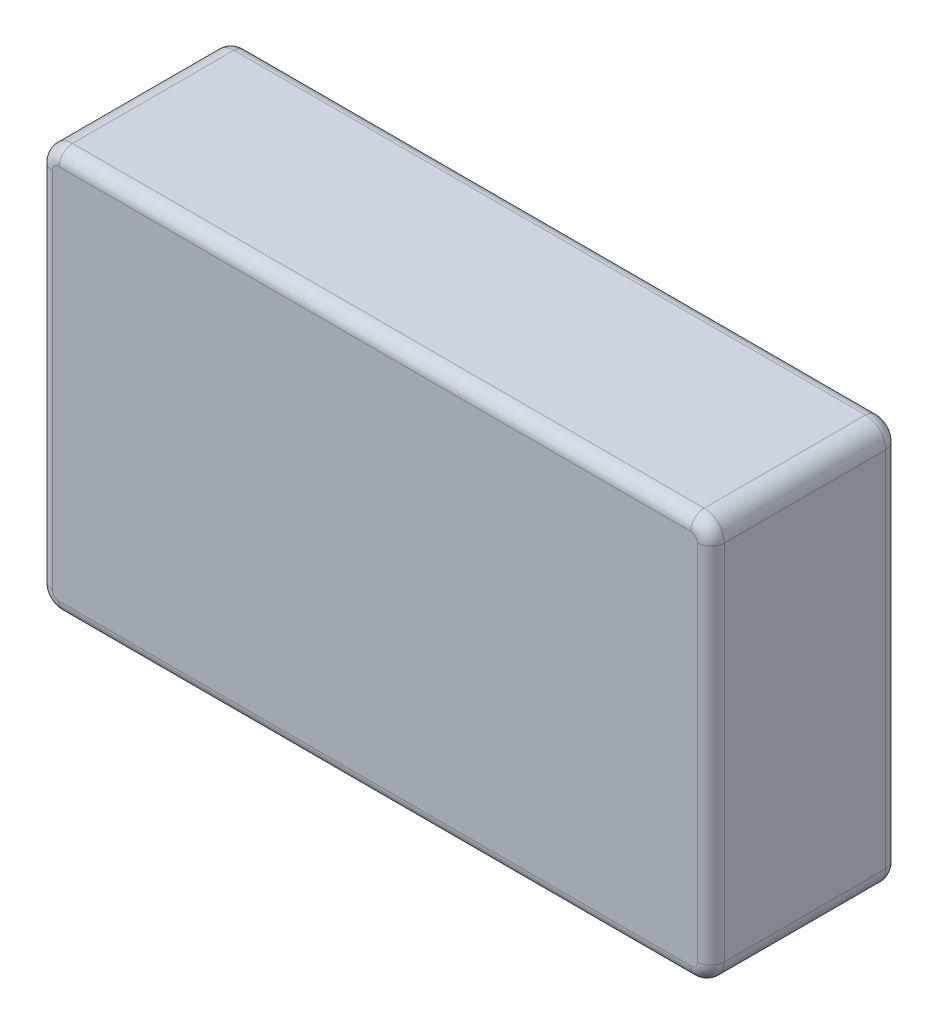
ISO-10303-21;
HEADER;
FILE_DESCRIPTION(('STEP AP214'),'2;1');
FILE_NAME('part.step','',(''),(''),'','','');
FILE_SCHEMA(('AUTOMOTIVE_DESIGN { 1 0 10303 214 1 1 1 1 }'));
ENDSEC;
DATA;
#1=APPLICATION_CONTEXT('core data for automotive mechanical design processes');
#2=APPLICATION_PROTOCOL_DEFINITION('international standard','automotive_design',2000,#1);
#3=PRODUCT_CONTEXT('',#1,'mechanical');
#4=PRODUCT('Part','Part','',(#3));
#5=PRODUCT_RELATED_PRODUCT_CATEGORY('part','',(#4));
#6=PRODUCT_DEFINITION_FORMATION('','',#4);
#7=PRODUCT_DEFINITION_CONTEXT('part definition',#1,'design');
#8=PRODUCT_DEFINITION('design','',#6,#7);
#9=PRODUCT_DEFINITION_SHAPE('','',#8);
#10=(LENGTH_UNIT() NAMED_UNIT(*) SI_UNIT(.MILLI.,.METRE.));
#11=(NAMED_UNIT(*) PLANE_ANGLE_UNIT() SI_UNIT($,.RADIAN.));
#12=(NAMED_UNIT(*) SI_UNIT($,.STERADIAN.) SOLID_ANGLE_UNIT());
#13=UNCERTAINTY_MEASURE_WITH_UNIT(LENGTH_MEASURE(1.E-05),#10,'distance_accuracy_value','');
#14=(GEOMETRIC_REPRESENTATION_CONTEXT(3) GLOBAL_UNCERTAINTY_ASSIGNED_CONTEXT((#13)) GLOBAL_UNIT_ASSIGNED_CONTEXT((#10,
#11,#12)) REPRESENTATION_CONTEXT('',''));
#15=CARTESIAN_POINT('',(0.,0.,0.));
#16=DIRECTION('',(0.,0.,1.));
#17=DIRECTION('',(1.,0.,0.));
#18=AXIS2_PLACEMENT_3D('',#15,#16,#17);
#19=CARTESIAN_POINT('',(535.,-107.,351.));
#20=DIRECTION('',(0.,0.,-1.));
#21=DIRECTION('',(-1.,0.,0.));
#22=AXIS2_PLACEMENT_3D('',#19,#20,#21);
#23=CYLINDRICAL_SURFACE('',#22,2.9999999999999);
#24=DIRECTION('',(0.,0.,-1.));
#25=VECTOR('',#24,1.);
#26=CARTESIAN_POINT('',(535.,-110.,351.));
#27=LINE('',#26,#25);
#28=CARTESIAN_POINT('',(535.,-110.,349.));
#29=VERTEX_POINT('',#28);
#30=CARTESIAN_POINT('',(535.,-110.,325.));
#31=VERTEX_POINT('',#30);
#32=EDGE_CURVE('E180',#29,#31,#27,.T.);
#33=ORIENTED_EDGE('',*,*,#32,.F.);
#34=CARTESIAN_POINT('',(535.,-107.,349.));
#35=DIRECTION('',(0.,0.,1.));
#36=DIRECTION('',(1.,0.,0.));
#37=AXIS2_PLACEMENT_3D('',#34,#35,#36);
#38=CIRCLE('',#37,2.9999999999999);
#39=CARTESIAN_POINT('',(532.,-107.,349.));
#40=VERTEX_POINT('',#39);
#41=EDGE_CURVE('E163',#29,#40,#38,.F.);
#42=ORIENTED_EDGE('',*,*,#41,.T.);
#43=DIRECTION('',(0.,0.,-1.));
#44=VECTOR('',#43,1.);
#45=CARTESIAN_POINT('',(532.,-107.,351.));
#46=LINE('',#45,#44);
#47=CARTESIAN_POINT('',(532.,-107.,325.));
#48=VERTEX_POINT('',#47);
#49=EDGE_CURVE('E258',#40,#48,#46,.T.);
#50=ORIENTED_EDGE('',*,*,#49,.T.);
#51=CARTESIAN_POINT('',(535.,-107.,325.));
#52=DIRECTION('',(0.,0.,1.));
#53=DIRECTION('',(1.,0.,0.));
#54=AXIS2_PLACEMENT_3D('',#51,#52,#53);
#55=CIRCLE('',#54,2.9999999999999);
#56=EDGE_CURVE('E193',#48,#31,#55,.T.);
#57=ORIENTED_EDGE('',*,*,#56,.T.);
#58=EDGE_LOOP('',(#33,#42,#50,#57));
#59=FACE_BOUND('',#58,.T.);
#60=ADVANCED_FACE('F41',(#59),#23,.T.);
#61=CARTESIAN_POINT('',(535.,-110.,351.));
#62=DIRECTION('',(0.,1.,0.));
#63=DIRECTION('',(0.,0.,1.));
#64=AXIS2_PLACEMENT_3D('',#61,#62,#63);
#65=PLANE('',#64);
#66=ORIENTED_EDGE('',*,*,#32,.T.);
#67=DIRECTION('',(1.,0.,0.));
#68=VECTOR('',#67,1.);
#69=CARTESIAN_POINT('',(535.,-110.,325.));
#70=LINE('',#69,#68);
#71=CARTESIAN_POINT('',(629.,-110.,325.));
#72=VERTEX_POINT('',#71);
#73=EDGE_CURVE('E230',#31,#72,#70,.T.);
#74=ORIENTED_EDGE('',*,*,#73,.T.);
#75=DIRECTION('',(0.,0.,-1.));
#76=VECTOR('',#75,1.);
#77=CARTESIAN_POINT('',(629.,-110.,351.));
#78=LINE('',#77,#76);
#79=CARTESIAN_POINT('',(629.,-110.,349.));
#80=VERTEX_POINT('',#79);
#81=EDGE_CURVE('E315',#80,#72,#78,.T.);
#82=ORIENTED_EDGE('',*,*,#81,.F.);
#83=DIRECTION('',(1.,0.,0.));
#84=VECTOR('',#83,1.);
#85=CARTESIAN_POINT('',(535.,-110.,349.));
#86=LINE('',#85,#84);
#87=EDGE_CURVE('E229',#80,#29,#86,.F.);
#88=ORIENTED_EDGE('',*,*,#87,.T.);
#89=EDGE_LOOP('',(#66,#74,#82,#88));
#90=FACE_BOUND('',#89,.T.);
#91=ADVANCED_FACE('F323',(#90),#65,.F.);
#92=CARTESIAN_POINT('',(629.,-107.,351.));
#93=DIRECTION('',(0.,0.,-1.));
#94=DIRECTION('',(-1.,0.,0.));
#95=AXIS2_PLACEMENT_3D('',#92,#93,#94);
#96=CYLINDRICAL_SURFACE('',#95,2.99999999999987);
#97=DIRECTION('',(0.,0.,-1.));
#98=VECTOR('',#97,1.);
#99=CARTESIAN_POINT('',(632.,-107.,351.));
#100=LINE('',#99,#98);
#101=CARTESIAN_POINT('',(632.,-107.,349.));
#102=VERTEX_POINT('',#101);
#103=CARTESIAN_POINT('',(632.,-107.,325.));
#104=VERTEX_POINT('',#103);
#105=EDGE_CURVE('E301',#102,#104,#100,.T.);
#106=ORIENTED_EDGE('',*,*,#105,.F.);
#107=CARTESIAN_POINT('',(629.,-107.,349.));
#108=DIRECTION('',(0.,0.,1.));
#109=DIRECTION('',(1.,0.,0.));
#110=AXIS2_PLACEMENT_3D('',#107,#108,#109);
#111=CIRCLE('',#110,2.99999999999987);
#112=EDGE_CURVE('E207',#102,#80,#111,.F.);
#113=ORIENTED_EDGE('',*,*,#112,.T.);
#114=ORIENTED_EDGE('',*,*,#81,.T.);
#115=CARTESIAN_POINT('',(629.,-107.,325.));
#116=DIRECTION('',(0.,0.,1.));
#117=DIRECTION('',(1.,0.,0.));
#118=AXIS2_PLACEMENT_3D('',#115,#116,#117);
#119=CIRCLE('',#118,2.99999999999987);
#120=EDGE_CURVE('E210',#72,#104,#119,.T.);
#121=ORIENTED_EDGE('',*,*,#120,.T.);
#122=EDGE_LOOP('',(#106,#113,#114,#121));
#123=FACE_BOUND('',#122,.T.);
#124=ADVANCED_FACE('F365',(#123),#96,.T.);
#125=CARTESIAN_POINT('',(632.,-107.,351.));
#126=DIRECTION('',(-1.,0.,0.));
#127=DIRECTION('',(0.,0.,1.));
#128=AXIS2_PLACEMENT_3D('',#125,#126,#127);
#129=PLANE('',#128);
#130=DIRECTION('',(0.,0.,-1.));
#131=VECTOR('',#130,1.);
#132=CARTESIAN_POINT('',(632.,-53.,351.));
#133=LINE('',#132,#131);
#134=CARTESIAN_POINT('',(632.,-53.,349.));
#135=VERTEX_POINT('',#134);
#136=CARTESIAN_POINT('',(632.,-53.,325.));
#137=VERTEX_POINT('',#136);
#138=EDGE_CURVE('E302',#135,#137,#133,.T.);
#139=ORIENTED_EDGE('',*,*,#138,.F.);
#140=DIRECTION('',(0.,1.,0.));
#141=VECTOR('',#140,1.);
#142=CARTESIAN_POINT('',(632.,-107.,349.));
#143=LINE('',#142,#141);
#144=EDGE_CURVE('E237',#135,#102,#143,.F.);
#145=ORIENTED_EDGE('',*,*,#144,.T.);
#146=ORIENTED_EDGE('',*,*,#105,.T.);
#147=DIRECTION('',(0.,1.,0.));
#148=VECTOR('',#147,1.);
#149=CARTESIAN_POINT('',(632.,-107.,325.));
#150=LINE('',#149,#148);
#151=EDGE_CURVE('E231',#104,#137,#150,.T.);
#152=ORIENTED_EDGE('',*,*,#151,.T.);
#153=EDGE_LOOP('',(#139,#145,#146,#152));
#154=FACE_BOUND('',#153,.T.);
#155=ADVANCED_FACE('F297',(#154),#129,.F.);
#156=CARTESIAN_POINT('',(629.,-52.9999999999998,351.));
#157=DIRECTION('',(0.,0.,-1.));
#158=DIRECTION('',(-1.,0.,0.));
#159=AXIS2_PLACEMENT_3D('',#156,#157,#158);
#160=CYLINDRICAL_SURFACE('',#159,2.99999999999986);
#161=DIRECTION('',(0.,0.,-1.));
#162=VECTOR('',#161,1.);
#163=CARTESIAN_POINT('',(629.,-50.,351.));
#164=LINE('',#163,#162);
#165=CARTESIAN_POINT('',(629.,-50.,349.));
#166=VERTEX_POINT('',#165);
#167=CARTESIAN_POINT('',(629.,-50.,325.));
#168=VERTEX_POINT('',#167);
#169=EDGE_CURVE('E309',#166,#168,#164,.T.);
#170=ORIENTED_EDGE('',*,*,#169,.F.);
#171=CARTESIAN_POINT('',(629.,-52.9999999999998,349.));
#172=DIRECTION('',(0.,0.,1.));
#173=DIRECTION('',(1.,0.,0.));
#174=AXIS2_PLACEMENT_3D('',#171,#172,#173);
#175=CIRCLE('',#174,2.99999999999986);
#176=EDGE_CURVE('E202',#166,#135,#175,.F.);
#177=ORIENTED_EDGE('',*,*,#176,.T.);
#178=ORIENTED_EDGE('',*,*,#138,.T.);
#179=CARTESIAN_POINT('',(629.,-52.9999999999998,325.));
#180=DIRECTION('',(0.,0.,1.));
#181=DIRECTION('',(1.,0.,0.));
#182=AXIS2_PLACEMENT_3D('',#179,#180,#181);
#183=CIRCLE('',#182,2.99999999999986);
#184=EDGE_CURVE('E205',#137,#168,#183,.T.);
#185=ORIENTED_EDGE('',*,*,#184,.T.);
#186=EDGE_LOOP('',(#170,#177,#178,#185));
#187=FACE_BOUND('',#186,.T.);
#188=ADVANCED_FACE('F307',(#187),#160,.T.);
#189=CARTESIAN_POINT('',(629.,-50.,351.));
#190=DIRECTION('',(0.,-1.,0.));
#191=DIRECTION('',(0.,0.,-1.));
#192=AXIS2_PLACEMENT_3D('',#189,#190,#191);
#193=PLANE('',#192);
#194=DIRECTION('',(0.,0.,-1.));
#195=VECTOR('',#194,1.);
#196=CARTESIAN_POINT('',(535.,-50.,351.));
#197=LINE('',#196,#195);
#198=CARTESIAN_POINT('',(535.,-50.,349.));
#199=VERTEX_POINT('',#198);
#200=CARTESIAN_POINT('',(535.,-50.,325.));
#201=VERTEX_POINT('',#200);
#202=EDGE_CURVE('E314',#199,#201,#197,.T.);
#203=ORIENTED_EDGE('',*,*,#202,.F.);
#204=DIRECTION('',(-1.,0.,0.));
#205=VECTOR('',#204,1.);
#206=CARTESIAN_POINT('',(629.,-50.,349.));
#207=LINE('',#206,#205);
#208=EDGE_CURVE('E11',#199,#166,#207,.F.);
#209=ORIENTED_EDGE('',*,*,#208,.T.);
#210=ORIENTED_EDGE('',*,*,#169,.T.);
#211=DIRECTION('',(-1.,0.,0.));
#212=VECTOR('',#211,1.);
#213=CARTESIAN_POINT('',(629.,-50.,325.));
#214=LINE('',#213,#212);
#215=EDGE_CURVE('E49',#168,#201,#214,.T.);
#216=ORIENTED_EDGE('',*,*,#215,.T.);
#217=EDGE_LOOP('',(#203,#209,#210,#216));
#218=FACE_BOUND('',#217,.T.);
#219=ADVANCED_FACE('F526',(#218),#193,.F.);
#220=CARTESIAN_POINT('',(535.,-52.9999999999999,351.));
#221=DIRECTION('',(0.,0.,-1.));
#222=DIRECTION('',(-1.,0.,0.));
#223=AXIS2_PLACEMENT_3D('',#220,#221,#222);
#224=CYLINDRICAL_SURFACE('',#223,2.99999999999989);
#225=DIRECTION('',(0.,0.,-1.));
#226=VECTOR('',#225,1.);
#227=CARTESIAN_POINT('',(532.,-53.,351.));
#228=LINE('',#227,#226);
#229=CARTESIAN_POINT('',(532.,-53.,349.));
#230=VERTEX_POINT('',#229);
#231=CARTESIAN_POINT('',(532.,-53.,325.));
#232=VERTEX_POINT('',#231);
#233=EDGE_CURVE('E328',#230,#232,#228,.T.);
#234=ORIENTED_EDGE('',*,*,#233,.F.);
#235=CARTESIAN_POINT('',(535.,-52.9999999999999,349.));
#236=DIRECTION('',(0.,0.,1.));
#237=DIRECTION('',(1.,0.,0.));
#238=AXIS2_PLACEMENT_3D('',#235,#236,#237);
#239=CIRCLE('',#238,2.99999999999989);
#240=EDGE_CURVE('E199',#230,#199,#239,.F.);
#241=ORIENTED_EDGE('',*,*,#240,.T.);
#242=ORIENTED_EDGE('',*,*,#202,.T.);
#243=CARTESIAN_POINT('',(535.,-52.9999999999999,325.));
#244=DIRECTION('',(0.,0.,1.));
#245=DIRECTION('',(1.,0.,0.));
#246=AXIS2_PLACEMENT_3D('',#243,#244,#245);
#247=CIRCLE('',#246,2.99999999999989);
#248=EDGE_CURVE('E196',#201,#232,#247,.T.);
#249=ORIENTED_EDGE('',*,*,#248,.T.);
#250=EDGE_LOOP('',(#234,#241,#242,#249));
#251=FACE_BOUND('',#250,.T.);
#252=ADVANCED_FACE('F340',(#251),#224,.T.);
#253=CARTESIAN_POINT('',(532.,-53.,351.));
#254=DIRECTION('',(1.,0.,0.));
#255=DIRECTION('',(0.,0.,-1.));
#256=AXIS2_PLACEMENT_3D('',#253,#254,#255);
#257=PLANE('',#256);
#258=ORIENTED_EDGE('',*,*,#233,.T.);
#259=DIRECTION('',(0.,-1.,0.));
#260=VECTOR('',#259,1.);
#261=CARTESIAN_POINT('',(532.,-53.,325.));
#262=LINE('',#261,#260);
#263=EDGE_CURVE('E235',#232,#48,#262,.T.);
#264=ORIENTED_EDGE('',*,*,#263,.T.);
#265=ORIENTED_EDGE('',*,*,#49,.F.);
#266=DIRECTION('',(0.,-1.,0.));
#267=VECTOR('',#266,1.);
#268=CARTESIAN_POINT('',(532.,-53.,349.));
#269=LINE('',#268,#267);
#270=EDGE_CURVE('E227',#40,#230,#269,.F.);
#271=ORIENTED_EDGE('',*,*,#270,.T.);
#272=EDGE_LOOP('',(#258,#264,#265,#271));
#273=FACE_BOUND('',#272,.T.);
#274=ADVANCED_FACE('F407',(#273),#257,.F.);
#275=CARTESIAN_POINT('',(535.,-107.,351.));
#276=DIRECTION('',(0.,0.,1.));
#277=DIRECTION('',(1.,0.,0.));
#278=AXIS2_PLACEMENT_3D('',#275,#276,#277);
#279=PLANE('',#278);
#280=CARTESIAN_POINT('',(629.,-52.9999999999998,351.));
#281=DIRECTION('',(0.,0.,1.));
#282=DIRECTION('',(1.,0.,0.));
#283=AXIS2_PLACEMENT_3D('',#280,#281,#282);
#284=CIRCLE('',#283,0.999999999999864);
#285=CARTESIAN_POINT('',(630.,-52.9999999999999,351.));
#286=VERTEX_POINT('',#285);
#287=CARTESIAN_POINT('',(629.,-52.,351.));
#288=VERTEX_POINT('',#287);
#289=EDGE_CURVE('E188',#286,#288,#284,.T.);
#290=ORIENTED_EDGE('',*,*,#289,.T.);
#291=DIRECTION('',(-1.,0.,0.));
#292=VECTOR('',#291,1.);
#293=CARTESIAN_POINT('',(535.,-52.,351.));
#294=LINE('',#293,#292);
#295=CARTESIAN_POINT('',(535.,-52.,351.));
#296=VERTEX_POINT('',#295);
#297=EDGE_CURVE('E194',#288,#296,#294,.T.);
#298=ORIENTED_EDGE('',*,*,#297,.T.);
#299=CARTESIAN_POINT('',(535.,-52.9999999999999,351.));
#300=DIRECTION('',(0.,0.,1.));
#301=DIRECTION('',(1.,0.,0.));
#302=AXIS2_PLACEMENT_3D('',#299,#300,#301);
#303=CIRCLE('',#302,0.999999999999892);
#304=CARTESIAN_POINT('',(534.,-52.9999999999999,351.));
#305=VERTEX_POINT('',#304);
#306=EDGE_CURVE('E192',#296,#305,#303,.T.);
#307=ORIENTED_EDGE('',*,*,#306,.T.);
#308=DIRECTION('',(0.,-1.,0.));
#309=VECTOR('',#308,1.);
#310=CARTESIAN_POINT('',(534.,-107.,351.));
#311=LINE('',#310,#309);
#312=CARTESIAN_POINT('',(534.,-107.,351.));
#313=VERTEX_POINT('',#312);
#314=EDGE_CURVE('E182',#305,#313,#311,.T.);
#315=ORIENTED_EDGE('',*,*,#314,.T.);
#316=CARTESIAN_POINT('',(535.,-107.,351.));
#317=DIRECTION('',(0.,0.,1.));
#318=DIRECTION('',(1.,0.,0.));
#319=AXIS2_PLACEMENT_3D('',#316,#317,#318);
#320=CIRCLE('',#319,0.999999999999899);
#321=CARTESIAN_POINT('',(535.,-108.,351.));
#322=VERTEX_POINT('',#321);
#323=EDGE_CURVE('E165',#313,#322,#320,.T.);
#324=ORIENTED_EDGE('',*,*,#323,.T.);
#325=DIRECTION('',(1.,0.,0.));
#326=VECTOR('',#325,1.);
#327=CARTESIAN_POINT('',(629.,-108.,351.));
#328=LINE('',#327,#326);
#329=CARTESIAN_POINT('',(629.,-108.,351.));
#330=VERTEX_POINT('',#329);
#331=EDGE_CURVE('E168',#322,#330,#328,.T.);
#332=ORIENTED_EDGE('',*,*,#331,.T.);
#333=CARTESIAN_POINT('',(629.,-107.,351.));
#334=DIRECTION('',(0.,0.,1.));
#335=DIRECTION('',(1.,0.,0.));
#336=AXIS2_PLACEMENT_3D('',#333,#334,#335);
#337=CIRCLE('',#336,0.999999999999871);
#338=CARTESIAN_POINT('',(630.,-107.,351.));
#339=VERTEX_POINT('',#338);
#340=EDGE_CURVE('E177',#330,#339,#337,.T.);
#341=ORIENTED_EDGE('',*,*,#340,.T.);
#342=DIRECTION('',(0.,1.,0.));
#343=VECTOR('',#342,1.);
#344=CARTESIAN_POINT('',(630.,-53.,351.));
#345=LINE('',#344,#343);
#346=EDGE_CURVE('E184',#339,#286,#345,.T.);
#347=ORIENTED_EDGE('',*,*,#346,.T.);
#348=EDGE_LOOP('',(#290,#298,#307,#315,#324,#332,#341,#347));
#349=FACE_BOUND('',#348,.T.);
#350=ADVANCED_FACE('F176',(#349),#279,.T.);
#351=CARTESIAN_POINT('',(535.,-107.,323.));
#352=DIRECTION('',(0.,0.,1.));
#353=DIRECTION('',(1.,0.,0.));
#354=AXIS2_PLACEMENT_3D('',#351,#352,#353);
#355=PLANE('',#354);
#356=CARTESIAN_POINT('',(629.,-52.9999999999998,323.));
#357=DIRECTION('',(0.,0.,1.));
#358=DIRECTION('',(1.,0.,0.));
#359=AXIS2_PLACEMENT_3D('',#356,#357,#358);
#360=CIRCLE('',#359,0.999999999999864);
#361=CARTESIAN_POINT('',(629.,-52.,323.));
#362=VERTEX_POINT('',#361);
#363=CARTESIAN_POINT('',(630.,-52.9999999999999,323.));
#364=VERTEX_POINT('',#363);
#365=EDGE_CURVE('E224',#362,#364,#360,.F.);
#366=ORIENTED_EDGE('',*,*,#365,.T.);
#367=DIRECTION('',(0.,1.,0.));
#368=VECTOR('',#367,1.);
#369=CARTESIAN_POINT('',(630.,-107.,323.));
#370=LINE('',#369,#368);
#371=CARTESIAN_POINT('',(630.,-107.,323.));
#372=VERTEX_POINT('',#371);
#373=EDGE_CURVE('E62',#364,#372,#370,.F.);
#374=ORIENTED_EDGE('',*,*,#373,.T.);
#375=CARTESIAN_POINT('',(629.,-107.,323.));
#376=DIRECTION('',(0.,0.,1.));
#377=DIRECTION('',(1.,0.,0.));
#378=AXIS2_PLACEMENT_3D('',#375,#376,#377);
#379=CIRCLE('',#378,0.999999999999871);
#380=CARTESIAN_POINT('',(629.,-108.,323.));
#381=VERTEX_POINT('',#380);
#382=EDGE_CURVE('E222',#372,#381,#379,.F.);
#383=ORIENTED_EDGE('',*,*,#382,.T.);
#384=DIRECTION('',(1.,0.,0.));
#385=VECTOR('',#384,1.);
#386=CARTESIAN_POINT('',(535.,-108.,323.));
#387=LINE('',#386,#385);
#388=CARTESIAN_POINT('',(535.,-108.,323.));
#389=VERTEX_POINT('',#388);
#390=EDGE_CURVE('E218',#381,#389,#387,.F.);
#391=ORIENTED_EDGE('',*,*,#390,.T.);
#392=CARTESIAN_POINT('',(535.,-107.,323.));
#393=DIRECTION('',(0.,0.,1.));
#394=DIRECTION('',(1.,0.,0.));
#395=AXIS2_PLACEMENT_3D('',#392,#393,#394);
#396=CIRCLE('',#395,0.999999999999899);
#397=CARTESIAN_POINT('',(534.,-107.,323.));
#398=VERTEX_POINT('',#397);
#399=EDGE_CURVE('E220',#389,#398,#396,.F.);
#400=ORIENTED_EDGE('',*,*,#399,.T.);
#401=DIRECTION('',(0.,-1.,0.));
#402=VECTOR('',#401,1.);
#403=CARTESIAN_POINT('',(534.,-107.,323.));
#404=LINE('',#403,#402);
#405=CARTESIAN_POINT('',(534.,-53.,323.));
#406=VERTEX_POINT('',#405);
#407=EDGE_CURVE('E214',#398,#406,#404,.F.);
#408=ORIENTED_EDGE('',*,*,#407,.T.);
#409=CARTESIAN_POINT('',(535.,-52.9999999999999,323.));
#410=DIRECTION('',(0.,0.,1.));
#411=DIRECTION('',(1.,0.,0.));
#412=AXIS2_PLACEMENT_3D('',#409,#410,#411);
#413=CIRCLE('',#412,0.999999999999892);
#414=CARTESIAN_POINT('',(535.,-52.,323.));
#415=VERTEX_POINT('',#414);
#416=EDGE_CURVE('E213',#406,#415,#413,.F.);
#417=ORIENTED_EDGE('',*,*,#416,.T.);
#418=DIRECTION('',(-1.,0.,0.));
#419=VECTOR('',#418,1.);
#420=CARTESIAN_POINT('',(535.,-52.,323.));
#421=LINE('',#420,#419);
#422=EDGE_CURVE('E211',#415,#362,#421,.F.);
#423=ORIENTED_EDGE('',*,*,#422,.T.);
#424=EDGE_LOOP('',(#366,#374,#383,#391,#400,#408,#417,#423));
#425=FACE_BOUND('',#424,.T.);
#426=ADVANCED_FACE('F290',(#425),#355,.F.);
#427=CARTESIAN_POINT('',(629.,-52.9999999999998,349.));
#428=DIRECTION('',(0.,0.,1.));
#429=DIRECTION('',(1.,0.,0.));
#430=AXIS2_PLACEMENT_3D('',#427,#428,#429);
#431=DEGENERATE_TOROIDAL_SURFACE('',#430,0.999999999999864,2.,.T.);
#432=CARTESIAN_POINT('',(630.,-52.9999999999999,349.));
#433=DIRECTION('',(0.,-1.,0.));
#434=DIRECTION('',(1.,0.,0.));
#435=AXIS2_PLACEMENT_3D('',#432,#433,#434);
#436=CIRCLE('',#435,2.);
#437=EDGE_CURVE('E248',#135,#286,#436,.T.);
#438=ORIENTED_EDGE('',*,*,#437,.F.);
#439=ORIENTED_EDGE('',*,*,#176,.F.);
#440=CARTESIAN_POINT('',(629.,-52.,349.));
#441=DIRECTION('',(-1.,0.,0.));
#442=DIRECTION('',(0.,-1.,0.));
#443=AXIS2_PLACEMENT_3D('',#440,#441,#442);
#444=CIRCLE('',#443,2.);
#445=EDGE_CURVE('E251',#288,#166,#444,.T.);
#446=ORIENTED_EDGE('',*,*,#445,.F.);
#447=ORIENTED_EDGE('',*,*,#289,.F.);
#448=EDGE_LOOP('',(#438,#439,#446,#447));
#449=FACE_BOUND('',#448,.T.);
#450=ADVANCED_FACE('F388',(#449),#431,.T.);
#451=CARTESIAN_POINT('',(535.,-52.,349.));
#452=DIRECTION('',(1.,0.,0.));
#453=DIRECTION('',(0.,0.,-1.));
#454=AXIS2_PLACEMENT_3D('',#451,#452,#453);
#455=CYLINDRICAL_SURFACE('',#454,2.);
#456=ORIENTED_EDGE('',*,*,#445,.T.);
#457=ORIENTED_EDGE('',*,*,#208,.F.);
#458=CARTESIAN_POINT('',(535.,-52.,349.));
#459=DIRECTION('',(-1.,0.,0.));
#460=DIRECTION('',(0.,-1.,0.));
#461=AXIS2_PLACEMENT_3D('',#458,#459,#460);
#462=CIRCLE('',#461,2.);
#463=EDGE_CURVE('E250',#296,#199,#462,.T.);
#464=ORIENTED_EDGE('',*,*,#463,.F.);
#465=ORIENTED_EDGE('',*,*,#297,.F.);
#466=EDGE_LOOP('',(#456,#457,#464,#465));
#467=FACE_BOUND('',#466,.T.);
#468=ADVANCED_FACE('F390',(#467),#455,.T.);
#469=CARTESIAN_POINT('',(630.,-107.,349.));
#470=DIRECTION('',(0.,-1.,0.));
#471=DIRECTION('',(0.,0.,-1.));
#472=AXIS2_PLACEMENT_3D('',#469,#470,#471);
#473=CYLINDRICAL_SURFACE('',#472,2.);
#474=ORIENTED_EDGE('',*,*,#437,.T.);
#475=ORIENTED_EDGE('',*,*,#346,.F.);
#476=CARTESIAN_POINT('',(630.,-107.,349.));
#477=DIRECTION('',(0.,-1.,0.));
#478=DIRECTION('',(0.,0.,-1.));
#479=AXIS2_PLACEMENT_3D('',#476,#477,#478);
#480=CIRCLE('',#479,2.);
#481=EDGE_CURVE('E243',#102,#339,#480,.T.);
#482=ORIENTED_EDGE('',*,*,#481,.F.);
#483=ORIENTED_EDGE('',*,*,#144,.F.);
#484=EDGE_LOOP('',(#474,#475,#482,#483));
#485=FACE_BOUND('',#484,.T.);
#486=ADVANCED_FACE('F382',(#485),#473,.T.);
#487=CARTESIAN_POINT('',(535.,-52.9999999999999,349.));
#488=DIRECTION('',(0.,0.,1.));
#489=DIRECTION('',(1.,0.,0.));
#490=AXIS2_PLACEMENT_3D('',#487,#488,#489);
#491=DEGENERATE_TOROIDAL_SURFACE('',#490,0.999999999999892,2.,.T.);
#492=ORIENTED_EDGE('',*,*,#463,.T.);
#493=ORIENTED_EDGE('',*,*,#240,.F.);
#494=CARTESIAN_POINT('',(534.,-52.9999999999999,349.));
#495=DIRECTION('',(0.,-1.,0.));
#496=DIRECTION('',(1.,0.,0.));
#497=AXIS2_PLACEMENT_3D('',#494,#495,#496);
#498=CIRCLE('',#497,2.);
#499=EDGE_CURVE('E244',#305,#230,#498,.T.);
#500=ORIENTED_EDGE('',*,*,#499,.F.);
#501=ORIENTED_EDGE('',*,*,#306,.F.);
#502=EDGE_LOOP('',(#492,#493,#500,#501));
#503=FACE_BOUND('',#502,.T.);
#504=ADVANCED_FACE('F377',(#503),#491,.T.);
#505=CARTESIAN_POINT('',(629.,-107.,349.));
#506=DIRECTION('',(0.,0.,1.));
#507=DIRECTION('',(1.,0.,0.));
#508=AXIS2_PLACEMENT_3D('',#505,#506,#507);
#509=DEGENERATE_TOROIDAL_SURFACE('',#508,0.999999999999871,2.,.T.);
#510=ORIENTED_EDGE('',*,*,#481,.T.);
#511=ORIENTED_EDGE('',*,*,#340,.F.);
#512=CARTESIAN_POINT('',(629.,-108.,349.));
#513=DIRECTION('',(-1.,0.,0.));
#514=DIRECTION('',(0.,-1.,0.));
#515=AXIS2_PLACEMENT_3D('',#512,#513,#514);
#516=CIRCLE('',#515,2.);
#517=EDGE_CURVE('E175',#80,#330,#516,.T.);
#518=ORIENTED_EDGE('',*,*,#517,.F.);
#519=ORIENTED_EDGE('',*,*,#112,.F.);
#520=EDGE_LOOP('',(#510,#511,#518,#519));
#521=FACE_BOUND('',#520,.T.);
#522=ADVANCED_FACE('F374',(#521),#509,.T.);
#523=CARTESIAN_POINT('',(534.,-107.,349.));
#524=DIRECTION('',(0.,1.,0.));
#525=DIRECTION('',(0.,0.,1.));
#526=AXIS2_PLACEMENT_3D('',#523,#524,#525);
#527=CYLINDRICAL_SURFACE('',#526,2.);
#528=ORIENTED_EDGE('',*,*,#499,.T.);
#529=ORIENTED_EDGE('',*,*,#270,.F.);
#530=CARTESIAN_POINT('',(534.,-107.,349.));
#531=DIRECTION('',(0.,-1.,0.));
#532=DIRECTION('',(1.,0.,0.));
#533=AXIS2_PLACEMENT_3D('',#530,#531,#532);
#534=CIRCLE('',#533,2.);
#535=EDGE_CURVE('E170',#313,#40,#534,.T.);
#536=ORIENTED_EDGE('',*,*,#535,.F.);
#537=ORIENTED_EDGE('',*,*,#314,.F.);
#538=EDGE_LOOP('',(#528,#529,#536,#537));
#539=FACE_BOUND('',#538,.T.);
#540=ADVANCED_FACE('F375',(#539),#527,.T.);
#541=CARTESIAN_POINT('',(535.,-108.,349.));
#542=DIRECTION('',(-1.,0.,0.));
#543=DIRECTION('',(0.,0.,1.));
#544=AXIS2_PLACEMENT_3D('',#541,#542,#543);
#545=CYLINDRICAL_SURFACE('',#544,2.);
#546=ORIENTED_EDGE('',*,*,#517,.T.);
#547=ORIENTED_EDGE('',*,*,#331,.F.);
#548=CARTESIAN_POINT('',(535.,-108.,349.));
#549=DIRECTION('',(-1.,0.,0.));
#550=DIRECTION('',(0.,0.,1.));
#551=AXIS2_PLACEMENT_3D('',#548,#549,#550);
#552=CIRCLE('',#551,2.);
#553=EDGE_CURVE('E158',#29,#322,#552,.T.);
#554=ORIENTED_EDGE('',*,*,#553,.F.);
#555=ORIENTED_EDGE('',*,*,#87,.F.);
#556=EDGE_LOOP('',(#546,#547,#554,#555));
#557=FACE_BOUND('',#556,.T.);
#558=ADVANCED_FACE('F174',(#557),#545,.T.);
#559=CARTESIAN_POINT('',(535.,-107.,349.));
#560=DIRECTION('',(0.,0.,1.));
#561=DIRECTION('',(1.,0.,0.));
#562=AXIS2_PLACEMENT_3D('',#559,#560,#561);
#563=DEGENERATE_TOROIDAL_SURFACE('',#562,0.999999999999899,2.,.T.);
#564=ORIENTED_EDGE('',*,*,#535,.T.);
#565=ORIENTED_EDGE('',*,*,#41,.F.);
#566=ORIENTED_EDGE('',*,*,#553,.T.);
#567=ORIENTED_EDGE('',*,*,#323,.F.);
#568=EDGE_LOOP('',(#564,#565,#566,#567));
#569=FACE_BOUND('',#568,.T.);
#570=ADVANCED_FACE('F159',(#569),#563,.T.);
#571=CARTESIAN_POINT('',(535.,-107.,325.));
#572=DIRECTION('',(0.,0.,1.));
#573=DIRECTION('',(1.,0.,0.));
#574=AXIS2_PLACEMENT_3D('',#571,#572,#573);
#575=DEGENERATE_TOROIDAL_SURFACE('',#574,0.999999999999899,2.,.T.);
#576=CARTESIAN_POINT('',(534.,-107.,325.));
#577=DIRECTION('',(0.,1.,0.));
#578=DIRECTION('',(-1.,0.,0.));
#579=AXIS2_PLACEMENT_3D('',#576,#577,#578);
#580=CIRCLE('',#579,2.);
#581=EDGE_CURVE('E271',#398,#48,#580,.T.);
#582=ORIENTED_EDGE('',*,*,#581,.F.);
#583=ORIENTED_EDGE('',*,*,#399,.F.);
#584=CARTESIAN_POINT('',(535.,-108.,325.));
#585=DIRECTION('',(1.,0.,0.));
#586=DIRECTION('',(0.,0.,-1.));
#587=AXIS2_PLACEMENT_3D('',#584,#585,#586);
#588=CIRCLE('',#587,2.);
#589=EDGE_CURVE('E44',#31,#389,#588,.T.);
#590=ORIENTED_EDGE('',*,*,#589,.F.);
#591=ORIENTED_EDGE('',*,*,#56,.F.);
#592=EDGE_LOOP('',(#582,#583,#590,#591));
#593=FACE_BOUND('',#592,.T.);
#594=ADVANCED_FACE('F43',(#593),#575,.T.);
#595=CARTESIAN_POINT('',(535.,-108.,325.));
#596=DIRECTION('',(1.,0.,0.));
#597=DIRECTION('',(0.,0.,-1.));
#598=AXIS2_PLACEMENT_3D('',#595,#596,#597);
#599=CYLINDRICAL_SURFACE('',#598,2.);
#600=ORIENTED_EDGE('',*,*,#589,.T.);
#601=ORIENTED_EDGE('',*,*,#390,.F.);
#602=CARTESIAN_POINT('',(629.,-108.,325.));
#603=DIRECTION('',(1.,0.,0.));
#604=DIRECTION('',(0.,0.,-1.));
#605=AXIS2_PLACEMENT_3D('',#602,#603,#604);
#606=CIRCLE('',#605,2.);
#607=EDGE_CURVE('E267',#72,#381,#606,.T.);
#608=ORIENTED_EDGE('',*,*,#607,.F.);
#609=ORIENTED_EDGE('',*,*,#73,.F.);
#610=EDGE_LOOP('',(#600,#601,#608,#609));
#611=FACE_BOUND('',#610,.T.);
#612=ADVANCED_FACE('F281',(#611),#599,.T.);
#613=CARTESIAN_POINT('',(534.,-53.,325.));
#614=DIRECTION('',(0.,-1.,0.));
#615=DIRECTION('',(0.,0.,-1.));
#616=AXIS2_PLACEMENT_3D('',#613,#614,#615);
#617=CYLINDRICAL_SURFACE('',#616,2.);
#618=ORIENTED_EDGE('',*,*,#581,.T.);
#619=ORIENTED_EDGE('',*,*,#263,.F.);
#620=CARTESIAN_POINT('',(534.,-53.,325.));
#621=DIRECTION('',(0.,1.,0.));
#622=DIRECTION('',(0.,0.,1.));
#623=AXIS2_PLACEMENT_3D('',#620,#621,#622);
#624=CIRCLE('',#623,2.);
#625=EDGE_CURVE('E266',#406,#232,#624,.T.);
#626=ORIENTED_EDGE('',*,*,#625,.F.);
#627=ORIENTED_EDGE('',*,*,#407,.F.);
#628=EDGE_LOOP('',(#618,#619,#626,#627));
#629=FACE_BOUND('',#628,.T.);
#630=ADVANCED_FACE('F412',(#629),#617,.T.);
#631=CARTESIAN_POINT('',(629.,-107.,325.));
#632=DIRECTION('',(0.,0.,1.));
#633=DIRECTION('',(1.,0.,0.));
#634=AXIS2_PLACEMENT_3D('',#631,#632,#633);
#635=DEGENERATE_TOROIDAL_SURFACE('',#634,0.999999999999871,2.,.T.);
#636=ORIENTED_EDGE('',*,*,#607,.T.);
#637=ORIENTED_EDGE('',*,*,#382,.F.);
#638=CARTESIAN_POINT('',(630.,-107.,325.));
#639=DIRECTION('',(0.,1.,0.));
#640=DIRECTION('',(0.,0.,1.));
#641=AXIS2_PLACEMENT_3D('',#638,#639,#640);
#642=CIRCLE('',#641,2.);
#643=EDGE_CURVE('E263',#104,#372,#642,.T.);
#644=ORIENTED_EDGE('',*,*,#643,.F.);
#645=ORIENTED_EDGE('',*,*,#120,.F.);
#646=EDGE_LOOP('',(#636,#637,#644,#645));
#647=FACE_BOUND('',#646,.T.);
#648=ADVANCED_FACE('F292',(#647),#635,.T.);
#649=CARTESIAN_POINT('',(535.,-52.9999999999999,325.));
#650=DIRECTION('',(0.,0.,1.));
#651=DIRECTION('',(1.,0.,0.));
#652=AXIS2_PLACEMENT_3D('',#649,#650,#651);
#653=DEGENERATE_TOROIDAL_SURFACE('',#652,0.999999999999892,2.,.T.);
#654=ORIENTED_EDGE('',*,*,#625,.T.);
#655=ORIENTED_EDGE('',*,*,#248,.F.);
#656=CARTESIAN_POINT('',(535.,-52.,325.));
#657=DIRECTION('',(1.,0.,0.));
#658=DIRECTION('',(0.,1.,0.));
#659=AXIS2_PLACEMENT_3D('',#656,#657,#658);
#660=CIRCLE('',#659,2.);
#661=EDGE_CURVE('E257',#415,#201,#660,.T.);
#662=ORIENTED_EDGE('',*,*,#661,.F.);
#663=ORIENTED_EDGE('',*,*,#416,.F.);
#664=EDGE_LOOP('',(#654,#655,#662,#663));
#665=FACE_BOUND('',#664,.T.);
#666=ADVANCED_FACE('F341',(#665),#653,.T.);
#667=CARTESIAN_POINT('',(630.,-107.,325.));
#668=DIRECTION('',(0.,1.,0.));
#669=DIRECTION('',(0.,0.,1.));
#670=AXIS2_PLACEMENT_3D('',#667,#668,#669);
#671=CYLINDRICAL_SURFACE('',#670,2.);
#672=ORIENTED_EDGE('',*,*,#643,.T.);
#673=ORIENTED_EDGE('',*,*,#373,.F.);
#674=CARTESIAN_POINT('',(630.,-53.,325.));
#675=DIRECTION('',(0.,1.,0.));
#676=DIRECTION('',(0.,0.,1.));
#677=AXIS2_PLACEMENT_3D('',#674,#675,#676);
#678=CIRCLE('',#677,2.);
#679=EDGE_CURVE('E59',#137,#364,#678,.T.);
#680=ORIENTED_EDGE('',*,*,#679,.F.);
#681=ORIENTED_EDGE('',*,*,#151,.F.);
#682=EDGE_LOOP('',(#672,#673,#680,#681));
#683=FACE_BOUND('',#682,.T.);
#684=ADVANCED_FACE('F293',(#683),#671,.T.);
#685=CARTESIAN_POINT('',(629.,-52.,325.));
#686=DIRECTION('',(-1.,0.,0.));
#687=DIRECTION('',(0.,0.,1.));
#688=AXIS2_PLACEMENT_3D('',#685,#686,#687);
#689=CYLINDRICAL_SURFACE('',#688,2.);
#690=ORIENTED_EDGE('',*,*,#661,.T.);
#691=ORIENTED_EDGE('',*,*,#215,.F.);
#692=CARTESIAN_POINT('',(629.,-52.,325.));
#693=DIRECTION('',(1.,0.,0.));
#694=DIRECTION('',(0.,1.,0.));
#695=AXIS2_PLACEMENT_3D('',#692,#693,#694);
#696=CIRCLE('',#695,2.);
#697=EDGE_CURVE('E260',#362,#168,#696,.T.);
#698=ORIENTED_EDGE('',*,*,#697,.F.);
#699=ORIENTED_EDGE('',*,*,#422,.F.);
#700=EDGE_LOOP('',(#690,#691,#698,#699));
#701=FACE_BOUND('',#700,.T.);
#702=ADVANCED_FACE('F349',(#701),#689,.T.);
#703=CARTESIAN_POINT('',(629.,-52.9999999999998,325.));
#704=DIRECTION('',(0.,0.,1.));
#705=DIRECTION('',(1.,0.,0.));
#706=AXIS2_PLACEMENT_3D('',#703,#704,#705);
#707=DEGENERATE_TOROIDAL_SURFACE('',#706,0.999999999999864,2.,.T.);
#708=ORIENTED_EDGE('',*,*,#679,.T.);
#709=ORIENTED_EDGE('',*,*,#365,.F.);
#710=ORIENTED_EDGE('',*,*,#697,.T.);
#711=ORIENTED_EDGE('',*,*,#184,.F.);
#712=EDGE_LOOP('',(#708,#709,#710,#711));
#713=FACE_BOUND('',#712,.T.);
#714=ADVANCED_FACE('F354',(#713),#707,.T.);
#715=CLOSED_SHELL('',(#60,#91,#124,#155,#188,#219,#252,#274,#350,#426,#450,#468,#486,#504,#522,
#540,#558,#570,#594,#612,#630,#648,#666,#684,#702,#714));
#716=MANIFOLD_SOLID_BREP('B2',#715);
#717=ADVANCED_BREP_SHAPE_REPRESENTATION('',(#18,#716),#14);
#718=SHAPE_DEFINITION_REPRESENTATION(#9,#717);
ENDSEC;
END-ISO-10303-21;
